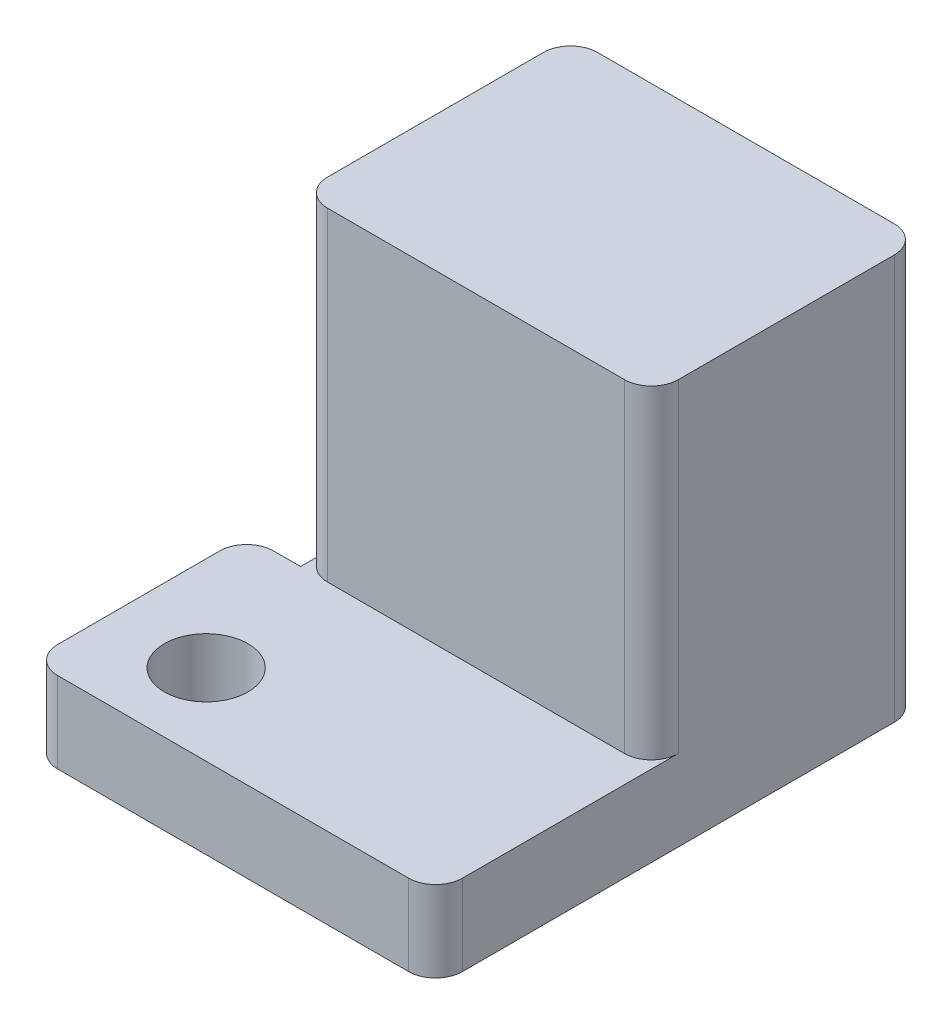
ISO-10303-21;
HEADER;
FILE_DESCRIPTION(('STEP AP214'),'2;1');
FILE_NAME('part.step','',(''),(''),'','','');
FILE_SCHEMA(('AUTOMOTIVE_DESIGN { 1 0 10303 214 1 1 1 1 }'));
ENDSEC;
DATA;
#1=APPLICATION_CONTEXT('core data for automotive mechanical design processes');
#2=APPLICATION_PROTOCOL_DEFINITION('international standard','automotive_design',2000,#1);
#3=PRODUCT_CONTEXT('',#1,'mechanical');
#4=PRODUCT('Part','Part','',(#3));
#5=PRODUCT_RELATED_PRODUCT_CATEGORY('part','',(#4));
#6=PRODUCT_DEFINITION_FORMATION('','',#4);
#7=PRODUCT_DEFINITION_CONTEXT('part definition',#1,'design');
#8=PRODUCT_DEFINITION('design','',#6,#7);
#9=PRODUCT_DEFINITION_SHAPE('','',#8);
#10=(LENGTH_UNIT() NAMED_UNIT(*) SI_UNIT(.MILLI.,.METRE.));
#11=(NAMED_UNIT(*) PLANE_ANGLE_UNIT() SI_UNIT($,.RADIAN.));
#12=(NAMED_UNIT(*) SI_UNIT($,.STERADIAN.) SOLID_ANGLE_UNIT());
#13=UNCERTAINTY_MEASURE_WITH_UNIT(LENGTH_MEASURE(1.E-05),#10,'distance_accuracy_value','');
#14=(GEOMETRIC_REPRESENTATION_CONTEXT(3) GLOBAL_UNCERTAINTY_ASSIGNED_CONTEXT((#13)) GLOBAL_UNIT_ASSIGNED_CONTEXT((#10,
#11,#12)) REPRESENTATION_CONTEXT('',''));
#15=CARTESIAN_POINT('',(0.,0.,0.));
#16=DIRECTION('',(0.,0.,1.));
#17=DIRECTION('',(1.,0.,0.));
#18=AXIS2_PLACEMENT_3D('',#15,#16,#17);
#19=CARTESIAN_POINT('',(0.,3.,0.));
#20=DIRECTION('',(0.,-1.,0.));
#21=DIRECTION('',(0.,0.,-1.));
#22=AXIS2_PLACEMENT_3D('',#19,#20,#21);
#23=PLANE('',#22);
#24=CARTESIAN_POINT('',(3.5,3.,-3.));
#25=DIRECTION('',(0.,1.,0.));
#26=DIRECTION('',(0.,0.,1.));
#27=AXIS2_PLACEMENT_3D('',#24,#25,#26);
#28=CIRCLE('',#27,1.55);
#29=CARTESIAN_POINT('',(3.5,3.,-1.45));
#30=VERTEX_POINT('',#29);
#31=EDGE_CURVE('E182',#30,#30,#28,.T.);
#32=ORIENTED_EDGE('',*,*,#31,.F.);
#33=EDGE_LOOP('',(#32));
#34=FACE_BOUND('',#33,.T.);
#35=DIRECTION('',(1.,0.,0.));
#36=VECTOR('',#35,1.);
#37=CARTESIAN_POINT('',(0.,3.,-8.));
#38=LINE('',#37,#36);
#39=CARTESIAN_POINT('',(1.,3.,-8.));
#40=VERTEX_POINT('',#39);
#41=CARTESIAN_POINT('',(2.,3.,-8.));
#42=VERTEX_POINT('',#41);
#43=EDGE_CURVE('E167',#40,#42,#38,.T.);
#44=ORIENTED_EDGE('',*,*,#43,.F.);
#45=CARTESIAN_POINT('',(1.,3.,-7.));
#46=DIRECTION('',(0.,-1.,0.));
#47=DIRECTION('',(0.,0.,-1.));
#48=AXIS2_PLACEMENT_3D('',#45,#46,#47);
#49=CIRCLE('',#48,1.);
#50=CARTESIAN_POINT('',(0.,3.,-7.));
#51=VERTEX_POINT('',#50);
#52=EDGE_CURVE('E275',#40,#51,#49,.F.);
#53=ORIENTED_EDGE('',*,*,#52,.T.);
#54=DIRECTION('',(0.,0.,1.));
#55=VECTOR('',#54,1.);
#56=CARTESIAN_POINT('',(0.,3.,0.));
#57=LINE('',#56,#55);
#58=CARTESIAN_POINT('',(0.,3.,-1.));
#59=VERTEX_POINT('',#58);
#60=EDGE_CURVE('E190',#51,#59,#57,.T.);
#61=ORIENTED_EDGE('',*,*,#60,.T.);
#62=CARTESIAN_POINT('',(1.,3.,-1.));
#63=DIRECTION('',(0.,-1.,0.));
#64=DIRECTION('',(0.,0.,-1.));
#65=AXIS2_PLACEMENT_3D('',#62,#63,#64);
#66=CIRCLE('',#65,1.);
#67=CARTESIAN_POINT('',(1.,3.,0.));
#68=VERTEX_POINT('',#67);
#69=EDGE_CURVE('E272',#59,#68,#66,.F.);
#70=ORIENTED_EDGE('',*,*,#69,.T.);
#71=DIRECTION('',(1.,0.,0.));
#72=VECTOR('',#71,1.);
#73=CARTESIAN_POINT('',(0.,3.,0.));
#74=LINE('',#73,#72);
#75=CARTESIAN_POINT('',(14.,3.,0.));
#76=VERTEX_POINT('',#75);
#77=EDGE_CURVE('E194',#68,#76,#74,.T.);
#78=ORIENTED_EDGE('',*,*,#77,.T.);
#79=CARTESIAN_POINT('',(14.,3.,-1.));
#80=DIRECTION('',(0.,-1.,0.));
#81=DIRECTION('',(0.,0.,-1.));
#82=AXIS2_PLACEMENT_3D('',#79,#80,#81);
#83=CIRCLE('',#82,1.);
#84=CARTESIAN_POINT('',(15.,3.,-1.));
#85=VERTEX_POINT('',#84);
#86=EDGE_CURVE('E269',#76,#85,#83,.F.);
#87=ORIENTED_EDGE('',*,*,#86,.T.);
#88=DIRECTION('',(0.,0.,1.));
#89=VECTOR('',#88,1.);
#90=CARTESIAN_POINT('',(15.,3.,-8.));
#91=LINE('',#90,#89);
#92=CARTESIAN_POINT('',(15.,3.,-9.));
#93=VERTEX_POINT('',#92);
#94=EDGE_CURVE('E312',#93,#85,#91,.T.);
#95=ORIENTED_EDGE('',*,*,#94,.F.);
#96=CARTESIAN_POINT('',(14.,3.,-9.));
#97=DIRECTION('',(0.,-1.,0.));
#98=DIRECTION('',(0.,0.,-1.));
#99=AXIS2_PLACEMENT_3D('',#96,#97,#98);
#100=CIRCLE('',#99,1.);
#101=CARTESIAN_POINT('',(14.,3.,-8.));
#102=VERTEX_POINT('',#101);
#103=EDGE_CURVE('E11',#93,#102,#100,.T.);
#104=ORIENTED_EDGE('',*,*,#103,.T.);
#105=CARTESIAN_POINT('',(3.,3.,-8.));
#106=VERTEX_POINT('',#105);
#107=EDGE_CURVE('E169',#106,#102,#38,.T.);
#108=ORIENTED_EDGE('',*,*,#107,.F.);
#109=CARTESIAN_POINT('',(3.,3.,-9.));
#110=DIRECTION('',(0.,-1.,0.));
#111=DIRECTION('',(0.,0.,-1.));
#112=AXIS2_PLACEMENT_3D('',#109,#110,#111);
#113=CIRCLE('',#112,1.);
#114=CARTESIAN_POINT('',(2.,3.,-9.));
#115=VERTEX_POINT('',#114);
#116=EDGE_CURVE('E48',#106,#115,#113,.T.);
#117=ORIENTED_EDGE('',*,*,#116,.T.);
#118=DIRECTION('',(0.,0.,-1.));
#119=VECTOR('',#118,1.);
#120=CARTESIAN_POINT('',(2.,3.,-18.));
#121=LINE('',#120,#119);
#122=EDGE_CURVE('E55',#42,#115,#121,.T.);
#123=ORIENTED_EDGE('',*,*,#122,.F.);
#124=EDGE_LOOP('',(#44,#53,#61,#70,#78,#87,#95,#104,#108,#117,#123));
#125=FACE_BOUND('',#124,.T.);
#126=ADVANCED_FACE('F39',(#34,#125),#23,.F.);
#127=CARTESIAN_POINT('',(0.,0.,0.));
#128=DIRECTION('',(0.,-1.,0.));
#129=DIRECTION('',(0.,0.,-1.));
#130=AXIS2_PLACEMENT_3D('',#127,#128,#129);
#131=PLANE('',#130);
#132=CARTESIAN_POINT('',(3.5,0.,-3.));
#133=DIRECTION('',(0.,1.,0.));
#134=DIRECTION('',(0.,0.,1.));
#135=AXIS2_PLACEMENT_3D('',#132,#133,#134);
#136=CIRCLE('',#135,1.55);
#137=CARTESIAN_POINT('',(3.5,0.,-1.45));
#138=VERTEX_POINT('',#137);
#139=EDGE_CURVE('E181',#138,#138,#136,.T.);
#140=ORIENTED_EDGE('',*,*,#139,.T.);
#141=EDGE_LOOP('',(#140));
#142=FACE_BOUND('',#141,.T.);
#143=DIRECTION('',(0.,0.,1.));
#144=VECTOR('',#143,1.);
#145=CARTESIAN_POINT('',(0.,0.,0.));
#146=LINE('',#145,#144);
#147=CARTESIAN_POINT('',(0.,0.,-7.));
#148=VERTEX_POINT('',#147);
#149=CARTESIAN_POINT('',(0.,0.,-1.));
#150=VERTEX_POINT('',#149);
#151=EDGE_CURVE('E186',#148,#150,#146,.T.);
#152=ORIENTED_EDGE('',*,*,#151,.F.);
#153=CARTESIAN_POINT('',(1.,0.,-7.));
#154=DIRECTION('',(0.,-1.,0.));
#155=DIRECTION('',(0.,0.,-1.));
#156=AXIS2_PLACEMENT_3D('',#153,#154,#155);
#157=CIRCLE('',#156,1.);
#158=CARTESIAN_POINT('',(1.,0.,-8.));
#159=VERTEX_POINT('',#158);
#160=EDGE_CURVE('E173',#148,#159,#157,.T.);
#161=ORIENTED_EDGE('',*,*,#160,.T.);
#162=DIRECTION('',(-1.,0.,0.));
#163=VECTOR('',#162,1.);
#164=CARTESIAN_POINT('',(0.,0.,-8.));
#165=LINE('',#164,#163);
#166=CARTESIAN_POINT('',(2.,0.,-8.));
#167=VERTEX_POINT('',#166);
#168=EDGE_CURVE('E160',#167,#159,#165,.T.);
#169=ORIENTED_EDGE('',*,*,#168,.F.);
#170=DIRECTION('',(0.,0.,1.));
#171=VECTOR('',#170,1.);
#172=CARTESIAN_POINT('',(2.,0.,-18.));
#173=LINE('',#172,#171);
#174=CARTESIAN_POINT('',(2.,0.,-17.));
#175=VERTEX_POINT('',#174);
#176=EDGE_CURVE('E149',#175,#167,#173,.T.);
#177=ORIENTED_EDGE('',*,*,#176,.F.);
#178=CARTESIAN_POINT('',(3.,0.,-17.));
#179=DIRECTION('',(0.,-1.,0.));
#180=DIRECTION('',(0.,0.,-1.));
#181=AXIS2_PLACEMENT_3D('',#178,#179,#180);
#182=CIRCLE('',#181,1.);
#183=CARTESIAN_POINT('',(3.,0.,-18.));
#184=VERTEX_POINT('',#183);
#185=EDGE_CURVE('E255',#175,#184,#182,.T.);
#186=ORIENTED_EDGE('',*,*,#185,.T.);
#187=DIRECTION('',(-1.,0.,0.));
#188=VECTOR('',#187,1.);
#189=CARTESIAN_POINT('',(0.,0.,-18.));
#190=LINE('',#189,#188);
#191=CARTESIAN_POINT('',(14.,0.,-18.));
#192=VERTEX_POINT('',#191);
#193=EDGE_CURVE('E195',#192,#184,#190,.T.);
#194=ORIENTED_EDGE('',*,*,#193,.F.);
#195=CARTESIAN_POINT('',(14.,0.,-17.));
#196=DIRECTION('',(0.,-1.,0.));
#197=DIRECTION('',(0.,0.,-1.));
#198=AXIS2_PLACEMENT_3D('',#195,#196,#197);
#199=CIRCLE('',#198,1.);
#200=CARTESIAN_POINT('',(15.,0.,-17.));
#201=VERTEX_POINT('',#200);
#202=EDGE_CURVE('E252',#192,#201,#199,.T.);
#203=ORIENTED_EDGE('',*,*,#202,.T.);
#204=DIRECTION('',(0.,0.,-1.));
#205=VECTOR('',#204,1.);
#206=CARTESIAN_POINT('',(15.,0.,0.));
#207=LINE('',#206,#205);
#208=CARTESIAN_POINT('',(15.,0.,-1.));
#209=VERTEX_POINT('',#208);
#210=EDGE_CURVE('E322',#209,#201,#207,.T.);
#211=ORIENTED_EDGE('',*,*,#210,.F.);
#212=CARTESIAN_POINT('',(14.,0.,-1.));
#213=DIRECTION('',(0.,-1.,0.));
#214=DIRECTION('',(0.,0.,-1.));
#215=AXIS2_PLACEMENT_3D('',#212,#213,#214);
#216=CIRCLE('',#215,1.);
#217=CARTESIAN_POINT('',(14.,0.,0.));
#218=VERTEX_POINT('',#217);
#219=EDGE_CURVE('E258',#209,#218,#216,.T.);
#220=ORIENTED_EDGE('',*,*,#219,.T.);
#221=DIRECTION('',(1.,0.,0.));
#222=VECTOR('',#221,1.);
#223=CARTESIAN_POINT('',(0.,0.,0.));
#224=LINE('',#223,#222);
#225=CARTESIAN_POINT('',(1.,0.,0.));
#226=VERTEX_POINT('',#225);
#227=EDGE_CURVE('E202',#226,#218,#224,.T.);
#228=ORIENTED_EDGE('',*,*,#227,.F.);
#229=CARTESIAN_POINT('',(1.,0.,-1.));
#230=DIRECTION('',(0.,-1.,0.));
#231=DIRECTION('',(0.,0.,-1.));
#232=AXIS2_PLACEMENT_3D('',#229,#230,#231);
#233=CIRCLE('',#232,1.);
#234=EDGE_CURVE('E261',#226,#150,#233,.T.);
#235=ORIENTED_EDGE('',*,*,#234,.T.);
#236=EDGE_LOOP('',(#152,#161,#169,#177,#186,#194,#203,#211,#220,#228,#235));
#237=FACE_BOUND('',#236,.T.);
#238=ADVANCED_FACE('F172',(#142,#237),#131,.T.);
#239=CARTESIAN_POINT('',(0.,3.,0.));
#240=DIRECTION('',(0.,0.,-1.));
#241=DIRECTION('',(-1.,0.,0.));
#242=AXIS2_PLACEMENT_3D('',#239,#240,#241);
#243=PLANE('',#242);
#244=ORIENTED_EDGE('',*,*,#77,.F.);
#245=DIRECTION('',(0.,-1.,0.));
#246=VECTOR('',#245,1.);
#247=CARTESIAN_POINT('',(1.,3.,0.));
#248=LINE('',#247,#246);
#249=EDGE_CURVE('E280',#68,#226,#248,.T.);
#250=ORIENTED_EDGE('',*,*,#249,.T.);
#251=ORIENTED_EDGE('',*,*,#227,.T.);
#252=DIRECTION('',(0.,-1.,0.));
#253=VECTOR('',#252,1.);
#254=CARTESIAN_POINT('',(14.,3.,0.));
#255=LINE('',#254,#253);
#256=EDGE_CURVE('E63',#218,#76,#255,.F.);
#257=ORIENTED_EDGE('',*,*,#256,.T.);
#258=EDGE_LOOP('',(#244,#250,#251,#257));
#259=FACE_BOUND('',#258,.T.);
#260=ADVANCED_FACE('F357',(#259),#243,.F.);
#261=CARTESIAN_POINT('',(0.,3.,-18.));
#262=DIRECTION('',(0.,0.,1.));
#263=DIRECTION('',(1.,0.,0.));
#264=AXIS2_PLACEMENT_3D('',#261,#262,#263);
#265=PLANE('',#264);
#266=ORIENTED_EDGE('',*,*,#193,.T.);
#267=DIRECTION('',(0.,-1.,0.));
#268=VECTOR('',#267,1.);
#269=CARTESIAN_POINT('',(3.,3.,-18.));
#270=LINE('',#269,#268);
#271=CARTESIAN_POINT('',(3.,15.,-18.));
#272=VERTEX_POINT('',#271);
#273=EDGE_CURVE('E287',#184,#272,#270,.F.);
#274=ORIENTED_EDGE('',*,*,#273,.T.);
#275=DIRECTION('',(-1.,0.,0.));
#276=VECTOR('',#275,1.);
#277=CARTESIAN_POINT('',(18.,15.,-18.));
#278=LINE('',#277,#276);
#279=CARTESIAN_POINT('',(14.,15.,-18.));
#280=VERTEX_POINT('',#279);
#281=EDGE_CURVE('E309',#280,#272,#278,.T.);
#282=ORIENTED_EDGE('',*,*,#281,.F.);
#283=DIRECTION('',(0.,1.,0.));
#284=VECTOR('',#283,1.);
#285=CARTESIAN_POINT('',(14.,0.,-18.));
#286=LINE('',#285,#284);
#287=EDGE_CURVE('E284',#280,#192,#286,.F.);
#288=ORIENTED_EDGE('',*,*,#287,.T.);
#289=EDGE_LOOP('',(#266,#274,#282,#288));
#290=FACE_BOUND('',#289,.T.);
#291=ADVANCED_FACE('F337',(#290),#265,.F.);
#292=CARTESIAN_POINT('',(0.,6.,-8.));
#293=DIRECTION('',(0.,0.,-1.));
#294=DIRECTION('',(-1.,0.,0.));
#295=AXIS2_PLACEMENT_3D('',#292,#293,#294);
#296=PLANE('',#295);
#297=DIRECTION('',(1.,0.,0.));
#298=VECTOR('',#297,1.);
#299=CARTESIAN_POINT('',(2.,15.,-8.));
#300=LINE('',#299,#298);
#301=CARTESIAN_POINT('',(3.,15.,-8.));
#302=VERTEX_POINT('',#301);
#303=CARTESIAN_POINT('',(14.,15.,-8.));
#304=VERTEX_POINT('',#303);
#305=EDGE_CURVE('E161',#302,#304,#300,.T.);
#306=ORIENTED_EDGE('',*,*,#305,.F.);
#307=DIRECTION('',(0.,-1.,0.));
#308=VECTOR('',#307,1.);
#309=CARTESIAN_POINT('',(3.,6.,-8.));
#310=LINE('',#309,#308);
#311=EDGE_CURVE('E210',#302,#106,#310,.T.);
#312=ORIENTED_EDGE('',*,*,#311,.T.);
#313=ORIENTED_EDGE('',*,*,#107,.T.);
#314=DIRECTION('',(0.,-1.,0.));
#315=VECTOR('',#314,1.);
#316=CARTESIAN_POINT('',(14.,15.,-8.));
#317=LINE('',#316,#315);
#318=EDGE_CURVE('E198',#102,#304,#317,.F.);
#319=ORIENTED_EDGE('',*,*,#318,.T.);
#320=EDGE_LOOP('',(#306,#312,#313,#319));
#321=FACE_BOUND('',#320,.T.);
#322=ADVANCED_FACE('F305',(#321),#296,.F.);
#323=CARTESIAN_POINT('',(0.,15.,0.));
#324=DIRECTION('',(0.,1.,0.));
#325=DIRECTION('',(0.,0.,1.));
#326=AXIS2_PLACEMENT_3D('',#323,#324,#325);
#327=PLANE('',#326);
#328=DIRECTION('',(0.,0.,1.));
#329=VECTOR('',#328,1.);
#330=CARTESIAN_POINT('',(2.,15.,-18.));
#331=LINE('',#330,#329);
#332=CARTESIAN_POINT('',(2.,15.,-17.));
#333=VERTEX_POINT('',#332);
#334=CARTESIAN_POINT('',(2.,15.,-9.));
#335=VERTEX_POINT('',#334);
#336=EDGE_CURVE('E303',#333,#335,#331,.T.);
#337=ORIENTED_EDGE('',*,*,#336,.T.);
#338=CARTESIAN_POINT('',(3.,15.,-9.));
#339=DIRECTION('',(0.,1.,0.));
#340=DIRECTION('',(0.,0.,1.));
#341=AXIS2_PLACEMENT_3D('',#338,#339,#340);
#342=CIRCLE('',#341,1.);
#343=EDGE_CURVE('E230',#335,#302,#342,.T.);
#344=ORIENTED_EDGE('',*,*,#343,.T.);
#345=ORIENTED_EDGE('',*,*,#305,.T.);
#346=CARTESIAN_POINT('',(14.,15.,-9.));
#347=DIRECTION('',(0.,1.,0.));
#348=DIRECTION('',(0.,0.,1.));
#349=AXIS2_PLACEMENT_3D('',#346,#347,#348);
#350=CIRCLE('',#349,1.);
#351=CARTESIAN_POINT('',(15.,15.,-9.));
#352=VERTEX_POINT('',#351);
#353=EDGE_CURVE('E227',#304,#352,#350,.T.);
#354=ORIENTED_EDGE('',*,*,#353,.T.);
#355=DIRECTION('',(0.,0.,1.));
#356=VECTOR('',#355,1.);
#357=CARTESIAN_POINT('',(15.,15.,-18.));
#358=LINE('',#357,#356);
#359=CARTESIAN_POINT('',(15.,15.,-17.));
#360=VERTEX_POINT('',#359);
#361=EDGE_CURVE('E318',#360,#352,#358,.T.);
#362=ORIENTED_EDGE('',*,*,#361,.F.);
#363=CARTESIAN_POINT('',(14.,15.,-17.));
#364=DIRECTION('',(0.,1.,0.));
#365=DIRECTION('',(0.,0.,1.));
#366=AXIS2_PLACEMENT_3D('',#363,#364,#365);
#367=CIRCLE('',#366,1.);
#368=EDGE_CURVE('E221',#360,#280,#367,.T.);
#369=ORIENTED_EDGE('',*,*,#368,.T.);
#370=ORIENTED_EDGE('',*,*,#281,.T.);
#371=CARTESIAN_POINT('',(3.,15.,-17.));
#372=DIRECTION('',(0.,1.,0.));
#373=DIRECTION('',(0.,0.,1.));
#374=AXIS2_PLACEMENT_3D('',#371,#372,#373);
#375=CIRCLE('',#374,1.);
#376=EDGE_CURVE('E224',#272,#333,#375,.T.);
#377=ORIENTED_EDGE('',*,*,#376,.T.);
#378=EDGE_LOOP('',(#337,#344,#345,#354,#362,#369,#370,#377));
#379=FACE_BOUND('',#378,.T.);
#380=ADVANCED_FACE('F301',(#379),#327,.T.);
#381=CARTESIAN_POINT('',(0.,3.,0.));
#382=DIRECTION('',(1.,0.,0.));
#383=DIRECTION('',(0.,0.,-1.));
#384=AXIS2_PLACEMENT_3D('',#381,#382,#383);
#385=PLANE('',#384);
#386=ORIENTED_EDGE('',*,*,#60,.F.);
#387=DIRECTION('',(0.,-1.,0.));
#388=VECTOR('',#387,1.);
#389=CARTESIAN_POINT('',(0.,3.,-7.));
#390=LINE('',#389,#388);
#391=EDGE_CURVE('E248',#51,#148,#390,.T.);
#392=ORIENTED_EDGE('',*,*,#391,.T.);
#393=ORIENTED_EDGE('',*,*,#151,.T.);
#394=DIRECTION('',(0.,-1.,0.));
#395=VECTOR('',#394,1.);
#396=CARTESIAN_POINT('',(0.,3.,-1.));
#397=LINE('',#396,#395);
#398=EDGE_CURVE('E245',#150,#59,#397,.F.);
#399=ORIENTED_EDGE('',*,*,#398,.T.);
#400=EDGE_LOOP('',(#386,#392,#393,#399));
#401=FACE_BOUND('',#400,.T.);
#402=ADVANCED_FACE('F369',(#401),#385,.F.);
#403=CARTESIAN_POINT('',(3.5,3.,-3.));
#404=DIRECTION('',(0.,-1.,0.));
#405=DIRECTION('',(0.,0.,-1.));
#406=AXIS2_PLACEMENT_3D('',#403,#404,#405);
#407=CYLINDRICAL_SURFACE('',#406,1.55);
#408=ORIENTED_EDGE('',*,*,#31,.T.);
#409=EDGE_LOOP('',(#408));
#410=FACE_BOUND('',#409,.T.);
#411=ORIENTED_EDGE('',*,*,#139,.F.);
#412=EDGE_LOOP('',(#411));
#413=FACE_BOUND('',#412,.T.);
#414=ADVANCED_FACE('F362',(#410,#413),#407,.F.);
#415=CARTESIAN_POINT('',(0.,16.1980390271856,-8.));
#416=DIRECTION('',(0.,0.,1.));
#417=DIRECTION('',(1.,0.,0.));
#418=AXIS2_PLACEMENT_3D('',#415,#416,#417);
#419=PLANE('',#418);
#420=ORIENTED_EDGE('',*,*,#168,.T.);
#421=DIRECTION('',(0.,-1.,0.));
#422=VECTOR('',#421,1.);
#423=CARTESIAN_POINT('',(1.,16.1980390271856,-8.));
#424=LINE('',#423,#422);
#425=EDGE_CURVE('E266',#159,#40,#424,.F.);
#426=ORIENTED_EDGE('',*,*,#425,.T.);
#427=ORIENTED_EDGE('',*,*,#43,.T.);
#428=DIRECTION('',(0.,-1.,0.));
#429=VECTOR('',#428,1.);
#430=CARTESIAN_POINT('',(2.,16.1980390271856,-8.));
#431=LINE('',#430,#429);
#432=EDGE_CURVE('E152',#42,#167,#431,.T.);
#433=ORIENTED_EDGE('',*,*,#432,.T.);
#434=EDGE_LOOP('',(#420,#426,#427,#433));
#435=FACE_BOUND('',#434,.T.);
#436=ADVANCED_FACE('F165',(#435),#419,.F.);
#437=CARTESIAN_POINT('',(2.,16.1980390271856,-18.));
#438=DIRECTION('',(1.,0.,0.));
#439=DIRECTION('',(0.,0.,-1.));
#440=AXIS2_PLACEMENT_3D('',#437,#438,#439);
#441=PLANE('',#440);
#442=ORIENTED_EDGE('',*,*,#432,.F.);
#443=ORIENTED_EDGE('',*,*,#122,.T.);
#444=DIRECTION('',(0.,-1.,0.));
#445=VECTOR('',#444,1.);
#446=CARTESIAN_POINT('',(2.,16.1980390271856,-9.));
#447=LINE('',#446,#445);
#448=EDGE_CURVE('E216',#115,#335,#447,.F.);
#449=ORIENTED_EDGE('',*,*,#448,.T.);
#450=ORIENTED_EDGE('',*,*,#336,.F.);
#451=DIRECTION('',(0.,-1.,0.));
#452=VECTOR('',#451,1.);
#453=CARTESIAN_POINT('',(2.,16.1980390271856,-17.));
#454=LINE('',#453,#452);
#455=EDGE_CURVE('E156',#333,#175,#454,.T.);
#456=ORIENTED_EDGE('',*,*,#455,.T.);
#457=ORIENTED_EDGE('',*,*,#176,.T.);
#458=EDGE_LOOP('',(#442,#443,#449,#450,#456,#457));
#459=FACE_BOUND('',#458,.T.);
#460=ADVANCED_FACE('F151',(#459),#441,.F.);
#461=CARTESIAN_POINT('',(15.,0.,0.));
#462=DIRECTION('',(1.,0.,0.));
#463=DIRECTION('',(0.,0.,-1.));
#464=AXIS2_PLACEMENT_3D('',#461,#462,#463);
#465=PLANE('',#464);
#466=ORIENTED_EDGE('',*,*,#361,.T.);
#467=DIRECTION('',(0.,-1.,0.));
#468=VECTOR('',#467,1.);
#469=CARTESIAN_POINT('',(15.,3.,-9.));
#470=LINE('',#469,#468);
#471=EDGE_CURVE('E241',#352,#93,#470,.T.);
#472=ORIENTED_EDGE('',*,*,#471,.T.);
#473=ORIENTED_EDGE('',*,*,#94,.T.);
#474=DIRECTION('',(0.,-1.,0.));
#475=VECTOR('',#474,1.);
#476=CARTESIAN_POINT('',(15.,0.,-1.));
#477=LINE('',#476,#475);
#478=EDGE_CURVE('E237',#85,#209,#477,.T.);
#479=ORIENTED_EDGE('',*,*,#478,.T.);
#480=ORIENTED_EDGE('',*,*,#210,.T.);
#481=DIRECTION('',(0.,1.,0.));
#482=VECTOR('',#481,1.);
#483=CARTESIAN_POINT('',(15.,15.,-17.));
#484=LINE('',#483,#482);
#485=EDGE_CURVE('E233',#201,#360,#484,.T.);
#486=ORIENTED_EDGE('',*,*,#485,.T.);
#487=EDGE_LOOP('',(#466,#472,#473,#479,#480,#486));
#488=FACE_BOUND('',#487,.T.);
#489=ADVANCED_FACE('F328',(#488),#465,.T.);
#490=CARTESIAN_POINT('',(3.,6.,-9.));
#491=DIRECTION('',(0.,-1.,0.));
#492=DIRECTION('',(0.,0.,-1.));
#493=AXIS2_PLACEMENT_3D('',#490,#491,#492);
#494=CYLINDRICAL_SURFACE('',#493,1.);
#495=ORIENTED_EDGE('',*,*,#343,.F.);
#496=ORIENTED_EDGE('',*,*,#448,.F.);
#497=ORIENTED_EDGE('',*,*,#116,.F.);
#498=ORIENTED_EDGE('',*,*,#311,.F.);
#499=EDGE_LOOP('',(#495,#496,#497,#498));
#500=FACE_BOUND('',#499,.T.);
#501=ADVANCED_FACE('F297',(#500),#494,.T.);
#502=CARTESIAN_POINT('',(14.,0.,-9.));
#503=DIRECTION('',(0.,1.,0.));
#504=DIRECTION('',(0.,0.,1.));
#505=AXIS2_PLACEMENT_3D('',#502,#503,#504);
#506=CYLINDRICAL_SURFACE('',#505,1.);
#507=ORIENTED_EDGE('',*,*,#353,.F.);
#508=ORIENTED_EDGE('',*,*,#318,.F.);
#509=ORIENTED_EDGE('',*,*,#103,.F.);
#510=ORIENTED_EDGE('',*,*,#471,.F.);
#511=EDGE_LOOP('',(#507,#508,#509,#510));
#512=FACE_BOUND('',#511,.T.);
#513=ADVANCED_FACE('F375',(#512),#506,.T.);
#514=CARTESIAN_POINT('',(1.,3.,-7.));
#515=DIRECTION('',(0.,-1.,0.));
#516=DIRECTION('',(0.,0.,-1.));
#517=AXIS2_PLACEMENT_3D('',#514,#515,#516);
#518=CYLINDRICAL_SURFACE('',#517,1.);
#519=ORIENTED_EDGE('',*,*,#52,.F.);
#520=ORIENTED_EDGE('',*,*,#425,.F.);
#521=ORIENTED_EDGE('',*,*,#160,.F.);
#522=ORIENTED_EDGE('',*,*,#391,.F.);
#523=EDGE_LOOP('',(#519,#520,#521,#522));
#524=FACE_BOUND('',#523,.T.);
#525=ADVANCED_FACE('F378',(#524),#518,.T.);
#526=CARTESIAN_POINT('',(1.,3.,-1.));
#527=DIRECTION('',(0.,-1.,0.));
#528=DIRECTION('',(0.,0.,-1.));
#529=AXIS2_PLACEMENT_3D('',#526,#527,#528);
#530=CYLINDRICAL_SURFACE('',#529,1.);
#531=ORIENTED_EDGE('',*,*,#69,.F.);
#532=ORIENTED_EDGE('',*,*,#398,.F.);
#533=ORIENTED_EDGE('',*,*,#234,.F.);
#534=ORIENTED_EDGE('',*,*,#249,.F.);
#535=EDGE_LOOP('',(#531,#532,#533,#534));
#536=FACE_BOUND('',#535,.T.);
#537=ADVANCED_FACE('F348',(#536),#530,.T.);
#538=CARTESIAN_POINT('',(14.,0.,-1.));
#539=DIRECTION('',(0.,1.,0.));
#540=DIRECTION('',(0.,0.,1.));
#541=AXIS2_PLACEMENT_3D('',#538,#539,#540);
#542=CYLINDRICAL_SURFACE('',#541,1.);
#543=ORIENTED_EDGE('',*,*,#86,.F.);
#544=ORIENTED_EDGE('',*,*,#256,.F.);
#545=ORIENTED_EDGE('',*,*,#219,.F.);
#546=ORIENTED_EDGE('',*,*,#478,.F.);
#547=EDGE_LOOP('',(#543,#544,#545,#546));
#548=FACE_BOUND('',#547,.T.);
#549=ADVANCED_FACE('F343',(#548),#542,.T.);
#550=CARTESIAN_POINT('',(3.,16.1980390271856,-17.));
#551=DIRECTION('',(0.,-1.,0.));
#552=DIRECTION('',(0.,0.,-1.));
#553=AXIS2_PLACEMENT_3D('',#550,#551,#552);
#554=CYLINDRICAL_SURFACE('',#553,1.);
#555=ORIENTED_EDGE('',*,*,#376,.F.);
#556=ORIENTED_EDGE('',*,*,#273,.F.);
#557=ORIENTED_EDGE('',*,*,#185,.F.);
#558=ORIENTED_EDGE('',*,*,#455,.F.);
#559=EDGE_LOOP('',(#555,#556,#557,#558));
#560=FACE_BOUND('',#559,.T.);
#561=ADVANCED_FACE('F341',(#560),#554,.T.);
#562=CARTESIAN_POINT('',(14.,0.,-17.));
#563=DIRECTION('',(0.,-1.,0.));
#564=DIRECTION('',(0.,0.,-1.));
#565=AXIS2_PLACEMENT_3D('',#562,#563,#564);
#566=CYLINDRICAL_SURFACE('',#565,1.);
#567=ORIENTED_EDGE('',*,*,#202,.F.);
#568=ORIENTED_EDGE('',*,*,#287,.F.);
#569=ORIENTED_EDGE('',*,*,#368,.F.);
#570=ORIENTED_EDGE('',*,*,#485,.F.);
#571=EDGE_LOOP('',(#567,#568,#569,#570));
#572=FACE_BOUND('',#571,.T.);
#573=ADVANCED_FACE('F41',(#572),#566,.T.);
#574=CLOSED_SHELL('',(#126,#238,#260,#291,#322,#380,#402,#414,#436,#460,#489,#501,#513,#525,
#537,#549,#561,#573));
#575=MANIFOLD_SOLID_BREP('B2',#574);
#576=ADVANCED_BREP_SHAPE_REPRESENTATION('',(#18,#575),#14);
#577=SHAPE_DEFINITION_REPRESENTATION(#9,#576);
ENDSEC;
END-ISO-10303-21;
